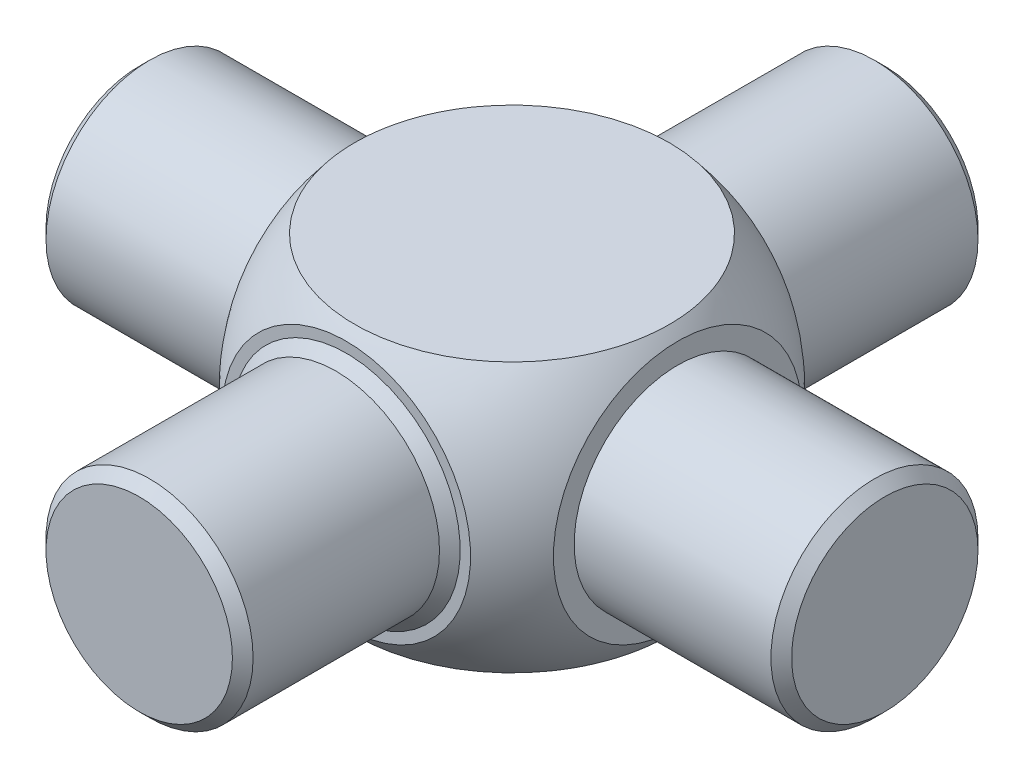
ISO-10303-21;
HEADER;
FILE_DESCRIPTION(('STEP AP214'),'2;1');
FILE_NAME('part.step','',(''),(''),'','','');
FILE_SCHEMA(('AUTOMOTIVE_DESIGN { 1 0 10303 214 1 1 1 1 }'));
ENDSEC;
DATA;
#1=APPLICATION_CONTEXT('core data for automotive mechanical design processes');
#2=APPLICATION_PROTOCOL_DEFINITION('international standard','automotive_design',2000,#1);
#3=PRODUCT_CONTEXT('',#1,'mechanical');
#4=PRODUCT('Part','Part','',(#3));
#5=PRODUCT_RELATED_PRODUCT_CATEGORY('part','',(#4));
#6=PRODUCT_DEFINITION_FORMATION('','',#4);
#7=PRODUCT_DEFINITION_CONTEXT('part definition',#1,'design');
#8=PRODUCT_DEFINITION('design','',#6,#7);
#9=PRODUCT_DEFINITION_SHAPE('','',#8);
#10=(LENGTH_UNIT() NAMED_UNIT(*) SI_UNIT(.MILLI.,.METRE.));
#11=(NAMED_UNIT(*) PLANE_ANGLE_UNIT() SI_UNIT($,.RADIAN.));
#12=(NAMED_UNIT(*) SI_UNIT($,.STERADIAN.) SOLID_ANGLE_UNIT());
#13=UNCERTAINTY_MEASURE_WITH_UNIT(LENGTH_MEASURE(1.E-05),#10,'distance_accuracy_value','');
#14=(GEOMETRIC_REPRESENTATION_CONTEXT(3) GLOBAL_UNCERTAINTY_ASSIGNED_CONTEXT((#13)) GLOBAL_UNIT_ASSIGNED_CONTEXT((#10,
#11,#12)) REPRESENTATION_CONTEXT('',''));
#15=CARTESIAN_POINT('',(0.,0.,0.));
#16=DIRECTION('',(0.,0.,1.));
#17=DIRECTION('',(1.,0.,0.));
#18=AXIS2_PLACEMENT_3D('',#15,#16,#17);
#19=CARTESIAN_POINT('',(0.,0.,0.));
#20=DIRECTION('',(1.,0.,0.));
#21=DIRECTION('',(0.,1.,0.));
#22=AXIS2_PLACEMENT_3D('',#19,#20,#21);
#23=SPHERICAL_SURFACE('',#22,10.);
#24=CARTESIAN_POINT('',(0.,0.,8.00000000000001));
#25=DIRECTION('',(0.,0.,-1.));
#26=DIRECTION('',(-1.,0.,0.));
#27=AXIS2_PLACEMENT_3D('',#24,#25,#26);
#28=CIRCLE('',#27,6.);
#29=CARTESIAN_POINT('',(-6.,0.,8.00000000000001));
#30=VERTEX_POINT('',#29);
#31=EDGE_CURVE('E68',#30,#30,#28,.F.);
#32=ORIENTED_EDGE('',*,*,#31,.F.);
#33=EDGE_LOOP('',(#32));
#34=FACE_BOUND('',#33,.T.);
#35=CARTESIAN_POINT('',(0.,0.,-8.00000000000001));
#36=DIRECTION('',(0.,0.,1.));
#37=DIRECTION('',(1.,0.,0.));
#38=AXIS2_PLACEMENT_3D('',#35,#36,#37);
#39=CIRCLE('',#38,6.);
#40=CARTESIAN_POINT('',(6.,0.,-8.00000000000001));
#41=VERTEX_POINT('',#40);
#42=EDGE_CURVE('E71',#41,#41,#39,.F.);
#43=ORIENTED_EDGE('',*,*,#42,.F.);
#44=EDGE_LOOP('',(#43));
#45=FACE_BOUND('',#44,.T.);
#46=CARTESIAN_POINT('',(0.,6.5,0.));
#47=DIRECTION('',(0.,-1.,0.));
#48=DIRECTION('',(0.,0.,-1.));
#49=AXIS2_PLACEMENT_3D('',#46,#47,#48);
#50=CIRCLE('',#49,7.59934207678534);
#51=CARTESIAN_POINT('',(0.,6.5,-7.59934207678534));
#52=VERTEX_POINT('',#51);
#53=EDGE_CURVE('E75',#52,#52,#50,.F.);
#54=ORIENTED_EDGE('',*,*,#53,.F.);
#55=EDGE_LOOP('',(#54));
#56=FACE_BOUND('',#55,.T.);
#57=CARTESIAN_POINT('',(0.,-6.5,0.));
#58=DIRECTION('',(0.,1.,0.));
#59=DIRECTION('',(0.,0.,1.));
#60=AXIS2_PLACEMENT_3D('',#57,#58,#59);
#61=CIRCLE('',#60,7.59934207678534);
#62=CARTESIAN_POINT('',(0.,-6.5,7.59934207678534));
#63=VERTEX_POINT('',#62);
#64=EDGE_CURVE('E78',#63,#63,#61,.F.);
#65=ORIENTED_EDGE('',*,*,#64,.F.);
#66=EDGE_LOOP('',(#65));
#67=FACE_BOUND('',#66,.T.);
#68=CARTESIAN_POINT('',(-8.00000000000001,0.,0.));
#69=DIRECTION('',(1.,0.,0.));
#70=DIRECTION('',(0.,0.,-1.));
#71=AXIS2_PLACEMENT_3D('',#68,#69,#70);
#72=CIRCLE('',#71,6.00000000000001);
#73=CARTESIAN_POINT('',(-8.00000000000001,0.,-6.00000000000001));
#74=VERTEX_POINT('',#73);
#75=EDGE_CURVE('E67',#74,#74,#72,.T.);
#76=ORIENTED_EDGE('',*,*,#75,.T.);
#77=EDGE_LOOP('',(#76));
#78=FACE_BOUND('',#77,.T.);
#79=CARTESIAN_POINT('',(8.00000000000001,0.,0.));
#80=DIRECTION('',(1.,0.,0.));
#81=DIRECTION('',(0.,0.,-1.));
#82=AXIS2_PLACEMENT_3D('',#79,#80,#81);
#83=CIRCLE('',#82,6.00000000000001);
#84=CARTESIAN_POINT('',(8.00000000000001,0.,-6.00000000000001));
#85=VERTEX_POINT('',#84);
#86=EDGE_CURVE('E81',#85,#85,#83,.T.);
#87=ORIENTED_EDGE('',*,*,#86,.F.);
#88=EDGE_LOOP('',(#87));
#89=FACE_BOUND('',#88,.T.);
#90=ADVANCED_FACE('F30',(#34,#45,#56,#67,#78,#89),#23,.T.);
#91=CARTESIAN_POINT('',(-8.00000000000001,6.00000000000001,0.));
#92=DIRECTION('',(-1.,0.,0.));
#93=DIRECTION('',(0.,0.,1.));
#94=AXIS2_PLACEMENT_3D('',#91,#92,#93);
#95=PLANE('',#94);
#96=CARTESIAN_POINT('',(-8.00000000000001,0.,0.));
#97=DIRECTION('',(1.,0.,0.));
#98=DIRECTION('',(0.,0.,-1.));
#99=AXIS2_PLACEMENT_3D('',#96,#97,#98);
#100=CIRCLE('',#99,5.);
#101=CARTESIAN_POINT('',(-8.00000000000001,0.,-5.));
#102=VERTEX_POINT('',#101);
#103=EDGE_CURVE('E84',#102,#102,#100,.T.);
#104=ORIENTED_EDGE('',*,*,#103,.T.);
#105=EDGE_LOOP('',(#104));
#106=FACE_BOUND('',#105,.T.);
#107=ORIENTED_EDGE('',*,*,#75,.F.);
#108=EDGE_LOOP('',(#107));
#109=FACE_BOUND('',#108,.T.);
#110=ADVANCED_FACE('F115',(#106,#109),#95,.T.);
#111=CARTESIAN_POINT('',(0.,0.,0.));
#112=DIRECTION('',(1.,0.,0.));
#113=DIRECTION('',(0.,0.,-1.));
#114=AXIS2_PLACEMENT_3D('',#111,#112,#113);
#115=CYLINDRICAL_SURFACE('',#114,5.);
#116=CARTESIAN_POINT('',(-17.5,0.,0.));
#117=DIRECTION('',(-1.,0.,0.));
#118=DIRECTION('',(0.,0.,1.));
#119=AXIS2_PLACEMENT_3D('',#116,#117,#118);
#120=CIRCLE('',#119,5.);
#121=CARTESIAN_POINT('',(-17.5,0.,5.));
#122=VERTEX_POINT('',#121);
#123=EDGE_CURVE('E44',#122,#122,#120,.F.);
#124=ORIENTED_EDGE('',*,*,#123,.T.);
#125=EDGE_LOOP('',(#124));
#126=FACE_BOUND('',#125,.T.);
#127=ORIENTED_EDGE('',*,*,#103,.F.);
#128=EDGE_LOOP('',(#127));
#129=FACE_BOUND('',#128,.T.);
#130=ADVANCED_FACE('F120',(#126,#129),#115,.T.);
#131=CARTESIAN_POINT('',(-18.,0.,0.));
#132=DIRECTION('',(-1.,0.,0.));
#133=DIRECTION('',(0.,0.,1.));
#134=AXIS2_PLACEMENT_3D('',#131,#132,#133);
#135=PLANE('',#134);
#136=CARTESIAN_POINT('',(-18.,0.,0.));
#137=DIRECTION('',(-1.,0.,0.));
#138=DIRECTION('',(0.,0.,1.));
#139=AXIS2_PLACEMENT_3D('',#136,#137,#138);
#140=CIRCLE('',#139,4.49999999999999);
#141=CARTESIAN_POINT('',(-18.,0.,4.49999999999999));
#142=VERTEX_POINT('',#141);
#143=EDGE_CURVE('E40',#142,#142,#140,.T.);
#144=ORIENTED_EDGE('',*,*,#143,.T.);
#145=EDGE_LOOP('',(#144));
#146=FACE_BOUND('',#145,.T.);
#147=ADVANCED_FACE('F148',(#146),#135,.T.);
#148=CARTESIAN_POINT('',(18.,0.,0.));
#149=DIRECTION('',(1.,0.,0.));
#150=DIRECTION('',(0.,0.,-1.));
#151=AXIS2_PLACEMENT_3D('',#148,#149,#150);
#152=PLANE('',#151);
#153=CARTESIAN_POINT('',(18.,0.,0.));
#154=DIRECTION('',(1.,0.,0.));
#155=DIRECTION('',(0.,0.,-1.));
#156=AXIS2_PLACEMENT_3D('',#153,#154,#155);
#157=CIRCLE('',#156,4.49999999999999);
#158=CARTESIAN_POINT('',(18.,0.,-4.49999999999999));
#159=VERTEX_POINT('',#158);
#160=EDGE_CURVE('E36',#159,#159,#157,.T.);
#161=ORIENTED_EDGE('',*,*,#160,.T.);
#162=EDGE_LOOP('',(#161));
#163=FACE_BOUND('',#162,.T.);
#164=ADVANCED_FACE('F143',(#163),#152,.T.);
#165=CARTESIAN_POINT('',(0.,0.,0.));
#166=DIRECTION('',(1.,0.,0.));
#167=DIRECTION('',(0.,0.,-1.));
#168=AXIS2_PLACEMENT_3D('',#165,#166,#167);
#169=CYLINDRICAL_SURFACE('',#168,5.);
#170=CARTESIAN_POINT('',(17.5,0.,0.));
#171=DIRECTION('',(1.,0.,0.));
#172=DIRECTION('',(0.,0.,-1.));
#173=AXIS2_PLACEMENT_3D('',#170,#171,#172);
#174=CIRCLE('',#173,5.);
#175=CARTESIAN_POINT('',(17.5,0.,-5.));
#176=VERTEX_POINT('',#175);
#177=EDGE_CURVE('E10',#176,#176,#174,.F.);
#178=ORIENTED_EDGE('',*,*,#177,.T.);
#179=EDGE_LOOP('',(#178));
#180=FACE_BOUND('',#179,.T.);
#181=CARTESIAN_POINT('',(8.00000000000001,0.,0.));
#182=DIRECTION('',(1.,0.,0.));
#183=DIRECTION('',(0.,0.,-1.));
#184=AXIS2_PLACEMENT_3D('',#181,#182,#183);
#185=CIRCLE('',#184,5.);
#186=CARTESIAN_POINT('',(8.00000000000001,0.,-5.));
#187=VERTEX_POINT('',#186);
#188=EDGE_CURVE('E87',#187,#187,#185,.T.);
#189=ORIENTED_EDGE('',*,*,#188,.T.);
#190=EDGE_LOOP('',(#189));
#191=FACE_BOUND('',#190,.T.);
#192=ADVANCED_FACE('F138',(#180,#191),#169,.T.);
#193=CARTESIAN_POINT('',(8.00000000000001,6.00000000000001,0.));
#194=DIRECTION('',(1.,0.,0.));
#195=DIRECTION('',(0.,0.,-1.));
#196=AXIS2_PLACEMENT_3D('',#193,#194,#195);
#197=PLANE('',#196);
#198=ORIENTED_EDGE('',*,*,#86,.T.);
#199=EDGE_LOOP('',(#198));
#200=FACE_BOUND('',#199,.T.);
#201=ORIENTED_EDGE('',*,*,#188,.F.);
#202=EDGE_LOOP('',(#201));
#203=FACE_BOUND('',#202,.T.);
#204=ADVANCED_FACE('F134',(#200,#203),#197,.T.);
#205=CARTESIAN_POINT('',(9.00000000000001,-6.5,-12.5));
#206=DIRECTION('',(0.,1.,0.));
#207=DIRECTION('',(0.,0.,1.));
#208=AXIS2_PLACEMENT_3D('',#205,#206,#207);
#209=PLANE('',#208);
#210=ORIENTED_EDGE('',*,*,#64,.T.);
#211=EDGE_LOOP('',(#210));
#212=FACE_BOUND('',#211,.T.);
#213=ADVANCED_FACE('F137',(#212),#209,.F.);
#214=CARTESIAN_POINT('',(9.00000000000001,6.5,-12.5));
#215=DIRECTION('',(0.,-1.,0.));
#216=DIRECTION('',(0.,0.,-1.));
#217=AXIS2_PLACEMENT_3D('',#214,#215,#216);
#218=PLANE('',#217);
#219=ORIENTED_EDGE('',*,*,#53,.T.);
#220=EDGE_LOOP('',(#219));
#221=FACE_BOUND('',#220,.T.);
#222=ADVANCED_FACE('F201',(#221),#218,.F.);
#223=CARTESIAN_POINT('',(-9.00000000000001,-12.5,-8.00000000000001));
#224=DIRECTION('',(0.,0.,1.));
#225=DIRECTION('',(1.,0.,0.));
#226=AXIS2_PLACEMENT_3D('',#223,#224,#225);
#227=PLANE('',#226);
#228=CARTESIAN_POINT('',(0.,0.,-8.00000000000001));
#229=DIRECTION('',(0.,0.,1.));
#230=DIRECTION('',(1.,0.,0.));
#231=AXIS2_PLACEMENT_3D('',#228,#229,#230);
#232=CIRCLE('',#231,5.);
#233=CARTESIAN_POINT('',(5.,0.,-8.00000000000001));
#234=VERTEX_POINT('',#233);
#235=EDGE_CURVE('E72',#234,#234,#232,.T.);
#236=ORIENTED_EDGE('',*,*,#235,.T.);
#237=EDGE_LOOP('',(#236));
#238=FACE_BOUND('',#237,.T.);
#239=ORIENTED_EDGE('',*,*,#42,.T.);
#240=EDGE_LOOP('',(#239));
#241=FACE_BOUND('',#240,.T.);
#242=ADVANCED_FACE('F95',(#238,#241),#227,.F.);
#243=CARTESIAN_POINT('',(-9.,-12.5,8.00000000000001));
#244=DIRECTION('',(0.,0.,-1.));
#245=DIRECTION('',(-1.,0.,0.));
#246=AXIS2_PLACEMENT_3D('',#243,#244,#245);
#247=PLANE('',#246);
#248=CARTESIAN_POINT('',(0.,0.,8.00000000000001));
#249=DIRECTION('',(0.,0.,-1.));
#250=DIRECTION('',(-1.,0.,0.));
#251=AXIS2_PLACEMENT_3D('',#248,#249,#250);
#252=CIRCLE('',#251,5.50000000000001);
#253=CARTESIAN_POINT('',(-5.50000000000001,0.,8.00000000000001));
#254=VERTEX_POINT('',#253);
#255=EDGE_CURVE('E64',#254,#254,#252,.T.);
#256=ORIENTED_EDGE('',*,*,#255,.T.);
#257=EDGE_LOOP('',(#256));
#258=FACE_BOUND('',#257,.T.);
#259=ORIENTED_EDGE('',*,*,#31,.T.);
#260=EDGE_LOOP('',(#259));
#261=FACE_BOUND('',#260,.T.);
#262=ADVANCED_FACE('F192',(#258,#261),#247,.F.);
#263=CARTESIAN_POINT('',(0.,0.,18.));
#264=DIRECTION('',(0.,0.,1.));
#265=DIRECTION('',(1.,0.,0.));
#266=AXIS2_PLACEMENT_3D('',#263,#264,#265);
#267=PLANE('',#266);
#268=CARTESIAN_POINT('',(0.,0.,18.));
#269=DIRECTION('',(0.,0.,1.));
#270=DIRECTION('',(1.,0.,0.));
#271=AXIS2_PLACEMENT_3D('',#268,#269,#270);
#272=CIRCLE('',#271,4.5);
#273=CARTESIAN_POINT('',(4.5,0.,18.));
#274=VERTEX_POINT('',#273);
#275=EDGE_CURVE('E55',#274,#274,#272,.T.);
#276=ORIENTED_EDGE('',*,*,#275,.T.);
#277=EDGE_LOOP('',(#276));
#278=FACE_BOUND('',#277,.T.);
#279=ADVANCED_FACE('F111',(#278),#267,.T.);
#280=CARTESIAN_POINT('',(0.,0.,0.));
#281=DIRECTION('',(0.,0.,1.));
#282=DIRECTION('',(1.,0.,0.));
#283=AXIS2_PLACEMENT_3D('',#280,#281,#282);
#284=CYLINDRICAL_SURFACE('',#283,5.);
#285=CARTESIAN_POINT('',(0.,0.,8.50000000000001));
#286=DIRECTION('',(0.,0.,-1.));
#287=DIRECTION('',(-1.,0.,0.));
#288=AXIS2_PLACEMENT_3D('',#285,#286,#287);
#289=CIRCLE('',#288,5.);
#290=CARTESIAN_POINT('',(-5.,0.,8.50000000000001));
#291=VERTEX_POINT('',#290);
#292=EDGE_CURVE('E58',#291,#291,#289,.F.);
#293=ORIENTED_EDGE('',*,*,#292,.T.);
#294=EDGE_LOOP('',(#293));
#295=FACE_BOUND('',#294,.T.);
#296=CARTESIAN_POINT('',(0.,0.,17.5));
#297=DIRECTION('',(0.,0.,1.));
#298=DIRECTION('',(1.,0.,0.));
#299=AXIS2_PLACEMENT_3D('',#296,#297,#298);
#300=CIRCLE('',#299,5.);
#301=CARTESIAN_POINT('',(5.,0.,17.5));
#302=VERTEX_POINT('',#301);
#303=EDGE_CURVE('E61',#302,#302,#300,.F.);
#304=ORIENTED_EDGE('',*,*,#303,.T.);
#305=EDGE_LOOP('',(#304));
#306=FACE_BOUND('',#305,.T.);
#307=ADVANCED_FACE('F101',(#295,#306),#284,.T.);
#308=CARTESIAN_POINT('',(0.,0.,-17.5));
#309=DIRECTION('',(0.,0.,-1.));
#310=DIRECTION('',(-1.,0.,0.));
#311=AXIS2_PLACEMENT_3D('',#308,#309,#310);
#312=CIRCLE('',#311,5.);
#313=CARTESIAN_POINT('',(-5.,0.,-17.5));
#314=VERTEX_POINT('',#313);
#315=EDGE_CURVE('E52',#314,#314,#312,.F.);
#316=ORIENTED_EDGE('',*,*,#315,.T.);
#317=EDGE_LOOP('',(#316));
#318=FACE_BOUND('',#317,.T.);
#319=ORIENTED_EDGE('',*,*,#235,.F.);
#320=EDGE_LOOP('',(#319));
#321=FACE_BOUND('',#320,.T.);
#322=ADVANCED_FACE('F98',(#318,#321),#284,.T.);
#323=CARTESIAN_POINT('',(0.,0.,-18.));
#324=DIRECTION('',(0.,0.,-1.));
#325=DIRECTION('',(-1.,0.,0.));
#326=AXIS2_PLACEMENT_3D('',#323,#324,#325);
#327=PLANE('',#326);
#328=CARTESIAN_POINT('',(0.,0.,-18.));
#329=DIRECTION('',(0.,0.,-1.));
#330=DIRECTION('',(-1.,0.,0.));
#331=AXIS2_PLACEMENT_3D('',#328,#329,#330);
#332=CIRCLE('',#331,4.5);
#333=CARTESIAN_POINT('',(-4.5,0.,-18.));
#334=VERTEX_POINT('',#333);
#335=EDGE_CURVE('E49',#334,#334,#332,.T.);
#336=ORIENTED_EDGE('',*,*,#335,.T.);
#337=EDGE_LOOP('',(#336));
#338=FACE_BOUND('',#337,.T.);
#339=ADVANCED_FACE('F100',(#338),#327,.T.);
#340=CARTESIAN_POINT('',(0.,0.,8.00000000000001));
#341=DIRECTION('',(0.,0.,-1.));
#342=DIRECTION('',(-1.,0.,0.));
#343=AXIS2_PLACEMENT_3D('',#340,#341,#342);
#344=CONICAL_SURFACE('',#343,5.50000000000001,0.785398163397453);
#345=ORIENTED_EDGE('',*,*,#292,.F.);
#346=EDGE_LOOP('',(#345));
#347=FACE_BOUND('',#346,.T.);
#348=ORIENTED_EDGE('',*,*,#255,.F.);
#349=EDGE_LOOP('',(#348));
#350=FACE_BOUND('',#349,.T.);
#351=ADVANCED_FACE('F108',(#347,#350),#344,.T.);
#352=CARTESIAN_POINT('',(0.,0.,18.));
#353=DIRECTION('',(0.,0.,-1.));
#354=DIRECTION('',(-1.,0.,0.));
#355=AXIS2_PLACEMENT_3D('',#352,#353,#354);
#356=CONICAL_SURFACE('',#355,4.5,0.785398163397453);
#357=ORIENTED_EDGE('',*,*,#303,.F.);
#358=EDGE_LOOP('',(#357));
#359=FACE_BOUND('',#358,.T.);
#360=ORIENTED_EDGE('',*,*,#275,.F.);
#361=EDGE_LOOP('',(#360));
#362=FACE_BOUND('',#361,.T.);
#363=ADVANCED_FACE('F176',(#359,#362),#356,.T.);
#364=CARTESIAN_POINT('',(0.,0.,-17.5));
#365=DIRECTION('',(0.,0.,1.));
#366=DIRECTION('',(1.,0.,0.));
#367=AXIS2_PLACEMENT_3D('',#364,#365,#366);
#368=CONICAL_SURFACE('',#367,5.,0.785398163397445);
#369=ORIENTED_EDGE('',*,*,#335,.F.);
#370=EDGE_LOOP('',(#369));
#371=FACE_BOUND('',#370,.T.);
#372=ORIENTED_EDGE('',*,*,#315,.F.);
#373=EDGE_LOOP('',(#372));
#374=FACE_BOUND('',#373,.T.);
#375=ADVANCED_FACE('F167',(#371,#374),#368,.T.);
#376=CARTESIAN_POINT('',(-17.5,0.,0.));
#377=DIRECTION('',(1.,0.,0.));
#378=DIRECTION('',(0.,0.,-1.));
#379=AXIS2_PLACEMENT_3D('',#376,#377,#378);
#380=CONICAL_SURFACE('',#379,5.,0.785398163397445);
#381=ORIENTED_EDGE('',*,*,#143,.F.);
#382=EDGE_LOOP('',(#381));
#383=FACE_BOUND('',#382,.T.);
#384=ORIENTED_EDGE('',*,*,#123,.F.);
#385=EDGE_LOOP('',(#384));
#386=FACE_BOUND('',#385,.T.);
#387=ADVANCED_FACE('F164',(#383,#386),#380,.T.);
#388=CARTESIAN_POINT('',(18.,0.,0.));
#389=DIRECTION('',(-1.,0.,0.));
#390=DIRECTION('',(0.,0.,1.));
#391=AXIS2_PLACEMENT_3D('',#388,#389,#390);
#392=CONICAL_SURFACE('',#391,4.49999999999999,0.785398163397453);
#393=ORIENTED_EDGE('',*,*,#177,.F.);
#394=EDGE_LOOP('',(#393));
#395=FACE_BOUND('',#394,.T.);
#396=ORIENTED_EDGE('',*,*,#160,.F.);
#397=EDGE_LOOP('',(#396));
#398=FACE_BOUND('',#397,.T.);
#399=ADVANCED_FACE('F166',(#395,#398),#392,.T.);
#400=CLOSED_SHELL('',(#90,#110,#130,#147,#164,#192,#204,#213,#222,#242,#262,#279,#307,#322,#339,
#351,#363,#375,#387,#399));
#401=MANIFOLD_SOLID_BREP('B2',#400);
#402=ADVANCED_BREP_SHAPE_REPRESENTATION('',(#18,#401),#14);
#403=SHAPE_DEFINITION_REPRESENTATION(#9,#402);
ENDSEC;
END-ISO-10303-21;
